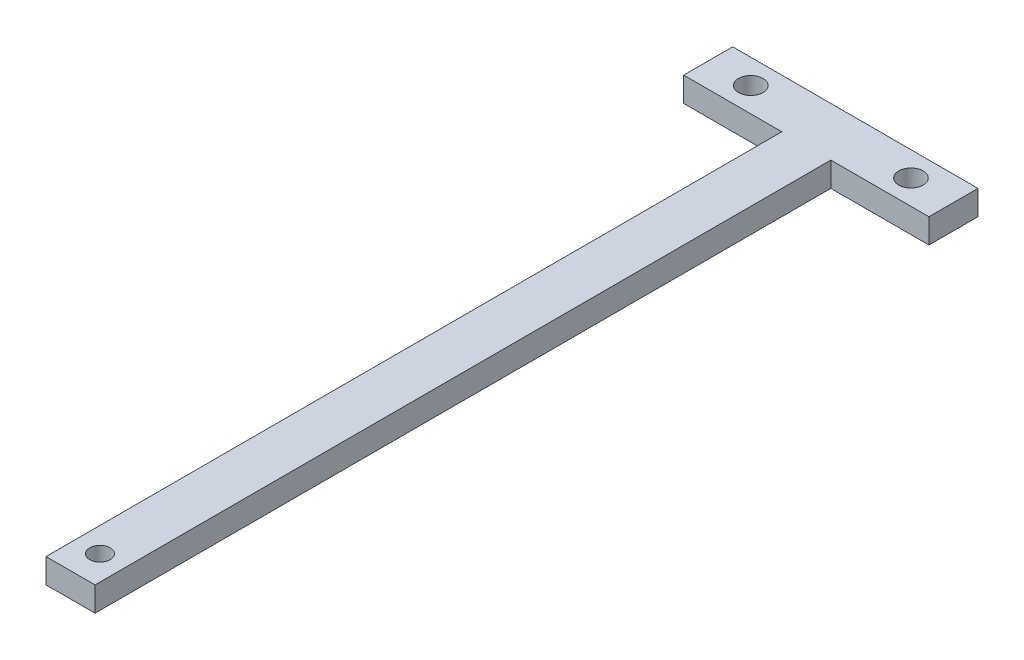
ISO-10303-21;
HEADER;
FILE_DESCRIPTION(('STEP AP214'),'2;1');
FILE_NAME('part.step','',(''),(''),'','','');
FILE_SCHEMA(('AUTOMOTIVE_DESIGN { 1 0 10303 214 1 1 1 1 }'));
ENDSEC;
DATA;
#1=APPLICATION_CONTEXT('core data for automotive mechanical design processes');
#2=APPLICATION_PROTOCOL_DEFINITION('international standard','automotive_design',2000,#1);
#3=PRODUCT_CONTEXT('',#1,'mechanical');
#4=PRODUCT('Part','Part','',(#3));
#5=PRODUCT_RELATED_PRODUCT_CATEGORY('part','',(#4));
#6=PRODUCT_DEFINITION_FORMATION('','',#4);
#7=PRODUCT_DEFINITION_CONTEXT('part definition',#1,'design');
#8=PRODUCT_DEFINITION('design','',#6,#7);
#9=PRODUCT_DEFINITION_SHAPE('','',#8);
#10=(LENGTH_UNIT() NAMED_UNIT(*) SI_UNIT(.MILLI.,.METRE.));
#11=(NAMED_UNIT(*) PLANE_ANGLE_UNIT() SI_UNIT($,.RADIAN.));
#12=(NAMED_UNIT(*) SI_UNIT($,.STERADIAN.) SOLID_ANGLE_UNIT());
#13=UNCERTAINTY_MEASURE_WITH_UNIT(LENGTH_MEASURE(1.E-05),#10,'distance_accuracy_value','');
#14=(GEOMETRIC_REPRESENTATION_CONTEXT(3) GLOBAL_UNCERTAINTY_ASSIGNED_CONTEXT((#13)) GLOBAL_UNIT_ASSIGNED_CONTEXT((#10,
#11,#12)) REPRESENTATION_CONTEXT('',''));
#15=CARTESIAN_POINT('',(0.,0.,0.));
#16=DIRECTION('',(0.,0.,1.));
#17=DIRECTION('',(1.,0.,0.));
#18=AXIS2_PLACEMENT_3D('',#15,#16,#17);
#19=CARTESIAN_POINT('',(0.,5.,0.));
#20=DIRECTION('',(-1.,0.,0.));
#21=DIRECTION('',(0.,0.,1.));
#22=AXIS2_PLACEMENT_3D('',#19,#20,#21);
#23=PLANE('',#22);
#24=DIRECTION('',(0.,0.,-1.));
#25=VECTOR('',#24,1.);
#26=CARTESIAN_POINT('',(0.,0.,0.));
#27=LINE('',#26,#25);
#28=CARTESIAN_POINT('',(0.,0.,0.));
#29=VERTEX_POINT('',#28);
#30=CARTESIAN_POINT('',(0.,0.,-150.));
#31=VERTEX_POINT('',#30);
#32=EDGE_CURVE('E140',#29,#31,#27,.T.);
#33=ORIENTED_EDGE('',*,*,#32,.F.);
#34=DIRECTION('',(0.,-1.,0.));
#35=VECTOR('',#34,1.);
#36=CARTESIAN_POINT('',(0.,5.,0.));
#37=LINE('',#36,#35);
#38=CARTESIAN_POINT('',(0.,5.,0.));
#39=VERTEX_POINT('',#38);
#40=EDGE_CURVE('E11',#39,#29,#37,.T.);
#41=ORIENTED_EDGE('',*,*,#40,.F.);
#42=DIRECTION('',(0.,0.,-1.));
#43=VECTOR('',#42,1.);
#44=CARTESIAN_POINT('',(0.,5.,0.));
#45=LINE('',#44,#43);
#46=CARTESIAN_POINT('',(0.,5.,-150.));
#47=VERTEX_POINT('',#46);
#48=EDGE_CURVE('E227',#39,#47,#45,.T.);
#49=ORIENTED_EDGE('',*,*,#48,.T.);
#50=DIRECTION('',(0.,-1.,0.));
#51=VECTOR('',#50,1.);
#52=CARTESIAN_POINT('',(0.,5.,-150.));
#53=LINE('',#52,#51);
#54=EDGE_CURVE('E52',#47,#31,#53,.T.);
#55=ORIENTED_EDGE('',*,*,#54,.T.);
#56=EDGE_LOOP('',(#33,#41,#49,#55));
#57=FACE_BOUND('',#56,.T.);
#58=ADVANCED_FACE('F35',(#57),#23,.T.);
#59=CARTESIAN_POINT('',(0.,5.,0.));
#60=DIRECTION('',(0.,0.,-1.));
#61=DIRECTION('',(-1.,0.,0.));
#62=AXIS2_PLACEMENT_3D('',#59,#60,#61);
#63=PLANE('',#62);
#64=DIRECTION('',(1.,0.,0.));
#65=VECTOR('',#64,1.);
#66=CARTESIAN_POINT('',(0.,0.,0.));
#67=LINE('',#66,#65);
#68=CARTESIAN_POINT('',(10.,0.,0.));
#69=VERTEX_POINT('',#68);
#70=EDGE_CURVE('E142',#29,#69,#67,.T.);
#71=ORIENTED_EDGE('',*,*,#70,.T.);
#72=DIRECTION('',(0.,-1.,0.));
#73=VECTOR('',#72,1.);
#74=CARTESIAN_POINT('',(10.,5.,0.));
#75=LINE('',#74,#73);
#76=CARTESIAN_POINT('',(10.,5.,0.));
#77=VERTEX_POINT('',#76);
#78=EDGE_CURVE('E44',#77,#69,#75,.T.);
#79=ORIENTED_EDGE('',*,*,#78,.F.);
#80=DIRECTION('',(1.,0.,0.));
#81=VECTOR('',#80,1.);
#82=CARTESIAN_POINT('',(0.,5.,0.));
#83=LINE('',#82,#81);
#84=EDGE_CURVE('E229',#39,#77,#83,.T.);
#85=ORIENTED_EDGE('',*,*,#84,.F.);
#86=ORIENTED_EDGE('',*,*,#40,.T.);
#87=EDGE_LOOP('',(#71,#79,#85,#86));
#88=FACE_BOUND('',#87,.T.);
#89=ADVANCED_FACE('F182',(#88),#63,.F.);
#90=CARTESIAN_POINT('',(10.,5.,0.));
#91=DIRECTION('',(-1.,0.,0.));
#92=DIRECTION('',(0.,0.,1.));
#93=AXIS2_PLACEMENT_3D('',#90,#91,#92);
#94=PLANE('',#93);
#95=DIRECTION('',(0.,0.,-1.));
#96=VECTOR('',#95,1.);
#97=CARTESIAN_POINT('',(10.,0.,0.));
#98=LINE('',#97,#96);
#99=CARTESIAN_POINT('',(10.,0.,-150.));
#100=VERTEX_POINT('',#99);
#101=EDGE_CURVE('E145',#69,#100,#98,.T.);
#102=ORIENTED_EDGE('',*,*,#101,.T.);
#103=DIRECTION('',(0.,-1.,0.));
#104=VECTOR('',#103,1.);
#105=CARTESIAN_POINT('',(10.,5.,-150.));
#106=LINE('',#105,#104);
#107=CARTESIAN_POINT('',(10.,5.,-150.));
#108=VERTEX_POINT('',#107);
#109=EDGE_CURVE('E172',#108,#100,#106,.T.);
#110=ORIENTED_EDGE('',*,*,#109,.F.);
#111=DIRECTION('',(0.,0.,-1.));
#112=VECTOR('',#111,1.);
#113=CARTESIAN_POINT('',(10.,5.,0.));
#114=LINE('',#113,#112);
#115=EDGE_CURVE('E178',#77,#108,#114,.T.);
#116=ORIENTED_EDGE('',*,*,#115,.F.);
#117=ORIENTED_EDGE('',*,*,#78,.T.);
#118=EDGE_LOOP('',(#102,#110,#116,#117));
#119=FACE_BOUND('',#118,.T.);
#120=ADVANCED_FACE('F176',(#119),#94,.F.);
#121=CARTESIAN_POINT('',(0.,5.,-150.));
#122=DIRECTION('',(0.,0.,1.));
#123=DIRECTION('',(1.,0.,0.));
#124=AXIS2_PLACEMENT_3D('',#121,#122,#123);
#125=PLANE('',#124);
#126=DIRECTION('',(-1.,0.,0.));
#127=VECTOR('',#126,1.);
#128=CARTESIAN_POINT('',(0.,0.,-150.));
#129=LINE('',#128,#127);
#130=CARTESIAN_POINT('',(30.,0.,-150.));
#131=VERTEX_POINT('',#130);
#132=EDGE_CURVE('E148',#131,#100,#129,.T.);
#133=ORIENTED_EDGE('',*,*,#132,.F.);
#134=DIRECTION('',(0.,-1.,0.));
#135=VECTOR('',#134,1.);
#136=CARTESIAN_POINT('',(30.,5.,-150.));
#137=LINE('',#136,#135);
#138=CARTESIAN_POINT('',(30.,5.,-150.));
#139=VERTEX_POINT('',#138);
#140=EDGE_CURVE('E170',#139,#131,#137,.T.);
#141=ORIENTED_EDGE('',*,*,#140,.F.);
#142=DIRECTION('',(-1.,0.,0.));
#143=VECTOR('',#142,1.);
#144=CARTESIAN_POINT('',(0.,5.,-150.));
#145=LINE('',#144,#143);
#146=EDGE_CURVE('E234',#139,#108,#145,.T.);
#147=ORIENTED_EDGE('',*,*,#146,.T.);
#148=ORIENTED_EDGE('',*,*,#109,.T.);
#149=EDGE_LOOP('',(#133,#141,#147,#148));
#150=FACE_BOUND('',#149,.T.);
#151=ADVANCED_FACE('F194',(#150),#125,.T.);
#152=CARTESIAN_POINT('',(30.,5.,0.));
#153=DIRECTION('',(-1.,0.,0.));
#154=DIRECTION('',(0.,0.,1.));
#155=AXIS2_PLACEMENT_3D('',#152,#153,#154);
#156=PLANE('',#155);
#157=DIRECTION('',(0.,0.,-1.));
#158=VECTOR('',#157,1.);
#159=CARTESIAN_POINT('',(30.,0.,0.));
#160=LINE('',#159,#158);
#161=CARTESIAN_POINT('',(30.,0.,-160.));
#162=VERTEX_POINT('',#161);
#163=EDGE_CURVE('E151',#131,#162,#160,.T.);
#164=ORIENTED_EDGE('',*,*,#163,.T.);
#165=DIRECTION('',(0.,-1.,0.));
#166=VECTOR('',#165,1.);
#167=CARTESIAN_POINT('',(30.,5.,-160.));
#168=LINE('',#167,#166);
#169=CARTESIAN_POINT('',(30.,5.,-160.));
#170=VERTEX_POINT('',#169);
#171=EDGE_CURVE('E111',#170,#162,#168,.T.);
#172=ORIENTED_EDGE('',*,*,#171,.F.);
#173=DIRECTION('',(0.,0.,-1.));
#174=VECTOR('',#173,1.);
#175=CARTESIAN_POINT('',(30.,5.,0.));
#176=LINE('',#175,#174);
#177=EDGE_CURVE('E122',#139,#170,#176,.T.);
#178=ORIENTED_EDGE('',*,*,#177,.F.);
#179=ORIENTED_EDGE('',*,*,#140,.T.);
#180=EDGE_LOOP('',(#164,#172,#178,#179));
#181=FACE_BOUND('',#180,.T.);
#182=ADVANCED_FACE('F197',(#181),#156,.F.);
#183=CARTESIAN_POINT('',(0.,5.,-160.));
#184=DIRECTION('',(0.,0.,-1.));
#185=DIRECTION('',(-1.,0.,0.));
#186=AXIS2_PLACEMENT_3D('',#183,#184,#185);
#187=PLANE('',#186);
#188=DIRECTION('',(1.,0.,0.));
#189=VECTOR('',#188,1.);
#190=CARTESIAN_POINT('',(0.,0.,-160.));
#191=LINE('',#190,#189);
#192=CARTESIAN_POINT('',(-20.,0.,-160.));
#193=VERTEX_POINT('',#192);
#194=EDGE_CURVE('E107',#193,#162,#191,.T.);
#195=ORIENTED_EDGE('',*,*,#194,.F.);
#196=DIRECTION('',(0.,-1.,0.));
#197=VECTOR('',#196,1.);
#198=CARTESIAN_POINT('',(-20.,5.,-160.));
#199=LINE('',#198,#197);
#200=CARTESIAN_POINT('',(-20.,5.,-160.));
#201=VERTEX_POINT('',#200);
#202=EDGE_CURVE('E102',#201,#193,#199,.T.);
#203=ORIENTED_EDGE('',*,*,#202,.F.);
#204=DIRECTION('',(1.,0.,0.));
#205=VECTOR('',#204,1.);
#206=CARTESIAN_POINT('',(0.,5.,-160.));
#207=LINE('',#206,#205);
#208=EDGE_CURVE('E105',#201,#170,#207,.T.);
#209=ORIENTED_EDGE('',*,*,#208,.T.);
#210=ORIENTED_EDGE('',*,*,#171,.T.);
#211=EDGE_LOOP('',(#195,#203,#209,#210));
#212=FACE_BOUND('',#211,.T.);
#213=ADVANCED_FACE('F104',(#212),#187,.T.);
#214=CARTESIAN_POINT('',(-20.,5.,0.));
#215=DIRECTION('',(-1.,0.,0.));
#216=DIRECTION('',(0.,0.,1.));
#217=AXIS2_PLACEMENT_3D('',#214,#215,#216);
#218=PLANE('',#217);
#219=DIRECTION('',(0.,0.,-1.));
#220=VECTOR('',#219,1.);
#221=CARTESIAN_POINT('',(-20.,0.,0.));
#222=LINE('',#221,#220);
#223=CARTESIAN_POINT('',(-20.,0.,-150.));
#224=VERTEX_POINT('',#223);
#225=EDGE_CURVE('E155',#224,#193,#222,.T.);
#226=ORIENTED_EDGE('',*,*,#225,.F.);
#227=DIRECTION('',(0.,-1.,0.));
#228=VECTOR('',#227,1.);
#229=CARTESIAN_POINT('',(-20.,5.,-150.));
#230=LINE('',#229,#228);
#231=CARTESIAN_POINT('',(-20.,5.,-150.));
#232=VERTEX_POINT('',#231);
#233=EDGE_CURVE('E77',#232,#224,#230,.T.);
#234=ORIENTED_EDGE('',*,*,#233,.F.);
#235=DIRECTION('',(0.,0.,-1.));
#236=VECTOR('',#235,1.);
#237=CARTESIAN_POINT('',(-20.,5.,0.));
#238=LINE('',#237,#236);
#239=EDGE_CURVE('E119',#232,#201,#238,.T.);
#240=ORIENTED_EDGE('',*,*,#239,.T.);
#241=ORIENTED_EDGE('',*,*,#202,.T.);
#242=EDGE_LOOP('',(#226,#234,#240,#241));
#243=FACE_BOUND('',#242,.T.);
#244=ADVANCED_FACE('F125',(#243),#218,.T.);
#245=CARTESIAN_POINT('',(-11.3269054871233,5.,-155.));
#246=DIRECTION('',(0.,-1.,0.));
#247=DIRECTION('',(0.,0.,-1.));
#248=AXIS2_PLACEMENT_3D('',#245,#246,#247);
#249=CYLINDRICAL_SURFACE('',#248,2.5);
#250=CARTESIAN_POINT('',(-11.3269054871233,5.,-155.));
#251=DIRECTION('',(0.,1.,0.));
#252=DIRECTION('',(0.,0.,1.));
#253=AXIS2_PLACEMENT_3D('',#250,#251,#252);
#254=CIRCLE('',#253,2.5);
#255=CARTESIAN_POINT('',(-11.3269054871233,5.,-152.5));
#256=VERTEX_POINT('',#255);
#257=EDGE_CURVE('E128',#256,#256,#254,.T.);
#258=ORIENTED_EDGE('',*,*,#257,.T.);
#259=EDGE_LOOP('',(#258));
#260=FACE_BOUND('',#259,.T.);
#261=CARTESIAN_POINT('',(-11.3269054871233,0.,-155.));
#262=DIRECTION('',(0.,1.,0.));
#263=DIRECTION('',(0.,0.,1.));
#264=AXIS2_PLACEMENT_3D('',#261,#262,#263);
#265=CIRCLE('',#264,2.5);
#266=CARTESIAN_POINT('',(-11.3269054871233,0.,-152.5));
#267=VERTEX_POINT('',#266);
#268=EDGE_CURVE('E160',#267,#267,#265,.T.);
#269=ORIENTED_EDGE('',*,*,#268,.F.);
#270=EDGE_LOOP('',(#269));
#271=FACE_BOUND('',#270,.T.);
#272=ADVANCED_FACE('F206',(#260,#271),#249,.F.);
#273=CARTESIAN_POINT('',(0.,5.,-150.));
#274=DIRECTION('',(0.,0.,1.));
#275=DIRECTION('',(1.,0.,0.));
#276=AXIS2_PLACEMENT_3D('',#273,#274,#275);
#277=PLANE('',#276);
#278=DIRECTION('',(-1.,0.,0.));
#279=VECTOR('',#278,1.);
#280=CARTESIAN_POINT('',(0.,0.,-150.));
#281=LINE('',#280,#279);
#282=EDGE_CURVE('E157',#31,#224,#281,.T.);
#283=ORIENTED_EDGE('',*,*,#282,.F.);
#284=ORIENTED_EDGE('',*,*,#54,.F.);
#285=DIRECTION('',(-1.,0.,0.));
#286=VECTOR('',#285,1.);
#287=CARTESIAN_POINT('',(0.,5.,-150.));
#288=LINE('',#287,#286);
#289=EDGE_CURVE('E126',#47,#232,#288,.T.);
#290=ORIENTED_EDGE('',*,*,#289,.T.);
#291=ORIENTED_EDGE('',*,*,#233,.T.);
#292=EDGE_LOOP('',(#283,#284,#290,#291));
#293=FACE_BOUND('',#292,.T.);
#294=ADVANCED_FACE('F207',(#293),#277,.T.);
#295=CARTESIAN_POINT('',(5.,5.,-6.));
#296=DIRECTION('',(0.,-1.,0.));
#297=DIRECTION('',(0.,0.,-1.));
#298=AXIS2_PLACEMENT_3D('',#295,#296,#297);
#299=CYLINDRICAL_SURFACE('',#298,2.09528419223641);
#300=CARTESIAN_POINT('',(5.,5.,-6.));
#301=DIRECTION('',(0.,1.,0.));
#302=DIRECTION('',(0.,0.,1.));
#303=AXIS2_PLACEMENT_3D('',#300,#301,#302);
#304=CIRCLE('',#303,2.09528419223641);
#305=CARTESIAN_POINT('',(5.,5.,-3.90471580776359));
#306=VERTEX_POINT('',#305);
#307=EDGE_CURVE('E166',#306,#306,#304,.T.);
#308=ORIENTED_EDGE('',*,*,#307,.T.);
#309=EDGE_LOOP('',(#308));
#310=FACE_BOUND('',#309,.T.);
#311=CARTESIAN_POINT('',(5.,0.,-6.));
#312=DIRECTION('',(0.,1.,0.));
#313=DIRECTION('',(0.,0.,1.));
#314=AXIS2_PLACEMENT_3D('',#311,#312,#313);
#315=CIRCLE('',#314,2.09528419223641);
#316=CARTESIAN_POINT('',(5.,0.,-3.90471580776359));
#317=VERTEX_POINT('',#316);
#318=EDGE_CURVE('E137',#317,#317,#315,.T.);
#319=ORIENTED_EDGE('',*,*,#318,.F.);
#320=EDGE_LOOP('',(#319));
#321=FACE_BOUND('',#320,.T.);
#322=ADVANCED_FACE('F37',(#310,#321),#299,.F.);
#323=CARTESIAN_POINT('',(21.3269054871233,5.,-155.));
#324=DIRECTION('',(0.,-1.,0.));
#325=DIRECTION('',(0.,0.,-1.));
#326=AXIS2_PLACEMENT_3D('',#323,#324,#325);
#327=CYLINDRICAL_SURFACE('',#326,2.50000000000001);
#328=CARTESIAN_POINT('',(21.3269054871233,5.,-155.));
#329=DIRECTION('',(0.,1.,0.));
#330=DIRECTION('',(0.,0.,1.));
#331=AXIS2_PLACEMENT_3D('',#328,#329,#330);
#332=CIRCLE('',#331,2.50000000000001);
#333=CARTESIAN_POINT('',(21.3269054871233,5.,-152.5));
#334=VERTEX_POINT('',#333);
#335=EDGE_CURVE('E134',#334,#334,#332,.F.);
#336=ORIENTED_EDGE('',*,*,#335,.F.);
#337=EDGE_LOOP('',(#336));
#338=FACE_BOUND('',#337,.T.);
#339=CARTESIAN_POINT('',(21.3269054871233,0.,-155.));
#340=DIRECTION('',(0.,1.,0.));
#341=DIRECTION('',(0.,0.,1.));
#342=AXIS2_PLACEMENT_3D('',#339,#340,#341);
#343=CIRCLE('',#342,2.50000000000001);
#344=CARTESIAN_POINT('',(21.3269054871233,0.,-152.5));
#345=VERTEX_POINT('',#344);
#346=EDGE_CURVE('E163',#345,#345,#343,.F.);
#347=ORIENTED_EDGE('',*,*,#346,.T.);
#348=EDGE_LOOP('',(#347));
#349=FACE_BOUND('',#348,.T.);
#350=ADVANCED_FACE('F213',(#338,#349),#327,.F.);
#351=CARTESIAN_POINT('',(0.,5.,0.));
#352=DIRECTION('',(0.,1.,0.));
#353=DIRECTION('',(0.,0.,1.));
#354=AXIS2_PLACEMENT_3D('',#351,#352,#353);
#355=PLANE('',#354);
#356=ORIENTED_EDGE('',*,*,#307,.F.);
#357=EDGE_LOOP('',(#356));
#358=FACE_BOUND('',#357,.T.);
#359=ORIENTED_EDGE('',*,*,#48,.F.);
#360=ORIENTED_EDGE('',*,*,#84,.T.);
#361=ORIENTED_EDGE('',*,*,#115,.T.);
#362=ORIENTED_EDGE('',*,*,#146,.F.);
#363=ORIENTED_EDGE('',*,*,#177,.T.);
#364=ORIENTED_EDGE('',*,*,#208,.F.);
#365=ORIENTED_EDGE('',*,*,#239,.F.);
#366=ORIENTED_EDGE('',*,*,#289,.F.);
#367=EDGE_LOOP('',(#359,#360,#361,#362,#363,#364,#365,#366));
#368=FACE_BOUND('',#367,.T.);
#369=ORIENTED_EDGE('',*,*,#257,.F.);
#370=EDGE_LOOP('',(#369));
#371=FACE_BOUND('',#370,.T.);
#372=ORIENTED_EDGE('',*,*,#335,.T.);
#373=EDGE_LOOP('',(#372));
#374=FACE_BOUND('',#373,.T.);
#375=ADVANCED_FACE('F116',(#358,#368,#371,#374),#355,.T.);
#376=CARTESIAN_POINT('',(0.,0.,0.));
#377=DIRECTION('',(0.,1.,0.));
#378=DIRECTION('',(0.,0.,1.));
#379=AXIS2_PLACEMENT_3D('',#376,#377,#378);
#380=PLANE('',#379);
#381=ORIENTED_EDGE('',*,*,#318,.T.);
#382=EDGE_LOOP('',(#381));
#383=FACE_BOUND('',#382,.T.);
#384=ORIENTED_EDGE('',*,*,#32,.T.);
#385=ORIENTED_EDGE('',*,*,#282,.T.);
#386=ORIENTED_EDGE('',*,*,#225,.T.);
#387=ORIENTED_EDGE('',*,*,#194,.T.);
#388=ORIENTED_EDGE('',*,*,#163,.F.);
#389=ORIENTED_EDGE('',*,*,#132,.T.);
#390=ORIENTED_EDGE('',*,*,#101,.F.);
#391=ORIENTED_EDGE('',*,*,#70,.F.);
#392=EDGE_LOOP('',(#384,#385,#386,#387,#388,#389,#390,#391));
#393=FACE_BOUND('',#392,.T.);
#394=ORIENTED_EDGE('',*,*,#268,.T.);
#395=EDGE_LOOP('',(#394));
#396=FACE_BOUND('',#395,.T.);
#397=ORIENTED_EDGE('',*,*,#346,.F.);
#398=EDGE_LOOP('',(#397));
#399=FACE_BOUND('',#398,.T.);
#400=ADVANCED_FACE('F184',(#383,#393,#396,#399),#380,.F.);
#401=CLOSED_SHELL('',(#58,#89,#120,#151,#182,#213,#244,#272,#294,#322,#350,#375,#400));
#402=MANIFOLD_SOLID_BREP('B2',#401);
#403=ADVANCED_BREP_SHAPE_REPRESENTATION('',(#18,#402),#14);
#404=SHAPE_DEFINITION_REPRESENTATION(#9,#403);
ENDSEC;
END-ISO-10303-21;
